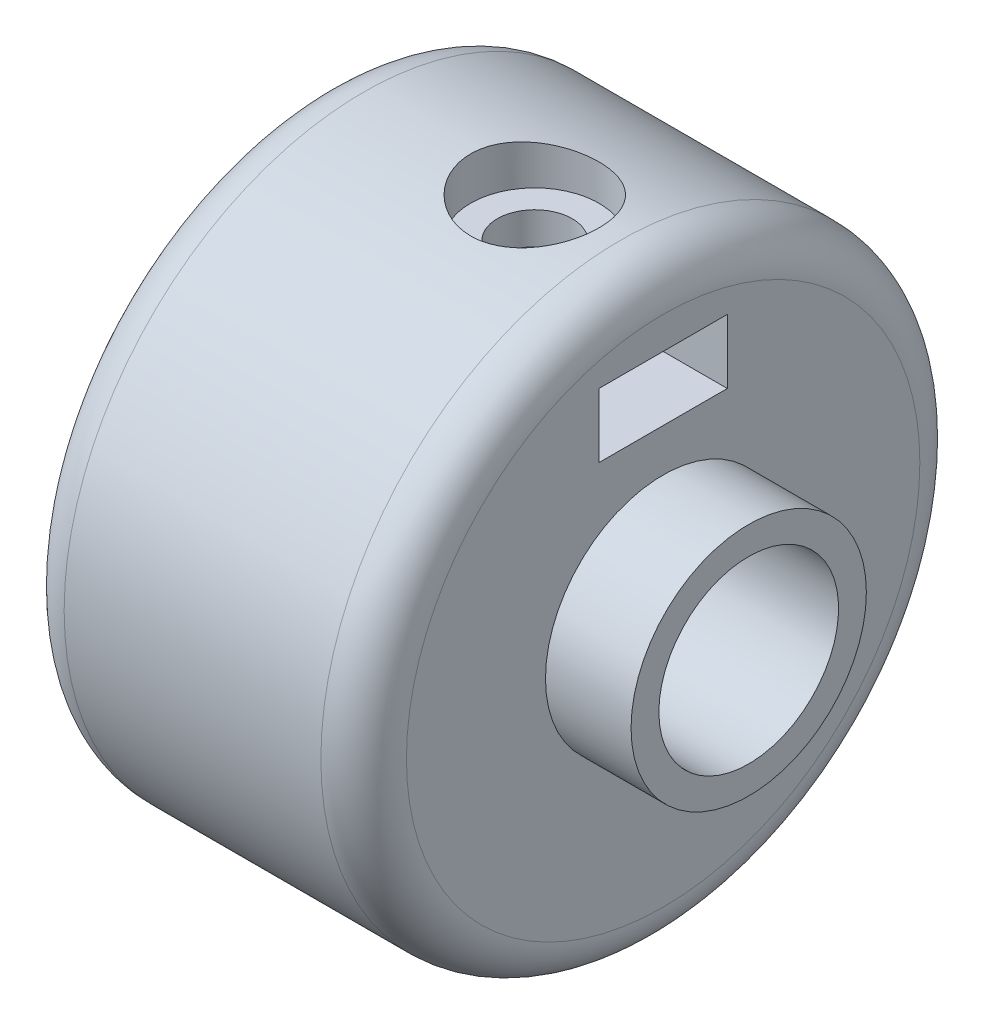
ISO-10303-21;
HEADER;
FILE_DESCRIPTION(('STEP AP214'),'2;1');
FILE_NAME('part.step','',(''),(''),'','','');
FILE_SCHEMA(('AUTOMOTIVE_DESIGN { 1 0 10303 214 1 1 1 1 }'));
ENDSEC;
DATA;
#1=APPLICATION_CONTEXT('core data for automotive mechanical design processes');
#2=APPLICATION_PROTOCOL_DEFINITION('international standard','automotive_design',2000,#1);
#3=PRODUCT_CONTEXT('',#1,'mechanical');
#4=PRODUCT('Part','Part','',(#3));
#5=PRODUCT_RELATED_PRODUCT_CATEGORY('part','',(#4));
#6=PRODUCT_DEFINITION_FORMATION('','',#4);
#7=PRODUCT_DEFINITION_CONTEXT('part definition',#1,'design');
#8=PRODUCT_DEFINITION('design','',#6,#7);
#9=PRODUCT_DEFINITION_SHAPE('','',#8);
#10=(LENGTH_UNIT() NAMED_UNIT(*) SI_UNIT(.MILLI.,.METRE.));
#11=(NAMED_UNIT(*) PLANE_ANGLE_UNIT() SI_UNIT($,.RADIAN.));
#12=(NAMED_UNIT(*) SI_UNIT($,.STERADIAN.) SOLID_ANGLE_UNIT());
#13=UNCERTAINTY_MEASURE_WITH_UNIT(LENGTH_MEASURE(1.E-05),#10,'distance_accuracy_value','');
#14=(GEOMETRIC_REPRESENTATION_CONTEXT(3) GLOBAL_UNCERTAINTY_ASSIGNED_CONTEXT((#13)) GLOBAL_UNIT_ASSIGNED_CONTEXT((#10,
#11,#12)) REPRESENTATION_CONTEXT('',''));
#15=CARTESIAN_POINT('',(0.,0.,0.));
#16=DIRECTION('',(0.,0.,1.));
#17=DIRECTION('',(1.,0.,0.));
#18=AXIS2_PLACEMENT_3D('',#15,#16,#17);
#19=CARTESIAN_POINT('',(-10.,14.,0.));
#20=DIRECTION('',(0.,-1.,0.));
#21=DIRECTION('',(0.,0.,-1.));
#22=AXIS2_PLACEMENT_3D('',#19,#20,#21);
#23=CYLINDRICAL_SURFACE('',#22,1.75);
#24=CARTESIAN_POINT('',(-10.,7.5,0.));
#25=DIRECTION('',(0.,-1.,0.));
#26=DIRECTION('',(0.,0.,-1.));
#27=AXIS2_PLACEMENT_3D('',#24,#25,#26);
#28=CIRCLE('',#27,1.75);
#29=CARTESIAN_POINT('',(-10.,7.5,-1.75));
#30=VERTEX_POINT('',#29);
#31=EDGE_CURVE('E109',#30,#30,#28,.T.);
#32=ORIENTED_EDGE('',*,*,#31,.F.);
#33=EDGE_LOOP('',(#32));
#34=FACE_BOUND('',#33,.T.);
#35=CARTESIAN_POINT('',(-10.,3.8180492401225,-1.75));
#36=CARTESIAN_POINT('',(-9.90665935274441,3.81805927388507,-1.74998962693195));
#37=CARTESIAN_POINT('',(-9.8131662804433,3.8215220334816,-1.74248485434104));
#38=CARTESIAN_POINT('',(-9.62887828112,3.83493367111238,-1.71275550526899));
#39=CARTESIAN_POINT('',(-9.53809138265467,3.84490016153974,-1.69049095604587));
#40=CARTESIAN_POINT('',(-9.3622144184325,3.86997684604675,-1.63225983787231));
#41=CARTESIAN_POINT('',(-9.27710277079898,3.88506604587662,-1.59634912403999));
#42=CARTESIAN_POINT('',(-9.11413677059073,3.9186580799211,-1.51200892856248));
#43=CARTESIAN_POINT('',(-9.03628070719363,3.93716010633097,-1.46358240828144));
#44=CARTESIAN_POINT('',(-8.88514398503714,3.97678067667799,-1.35236343574663));
#45=CARTESIAN_POINT('',(-8.81236941775827,3.99798795310804,-1.28891453345817));
#46=CARTESIAN_POINT('',(-8.67811968850342,4.03990013521117,-1.15083034604377));
#47=CARTESIAN_POINT('',(-8.61664888314179,4.06060484453105,-1.07619076792361));
#48=CARTESIAN_POINT('',(-8.50417065676901,4.10025753102859,-0.913868751316289));
#49=CARTESIAN_POINT('',(-8.45373272075471,4.11909035965407,-0.825761011157124));
#50=CARTESIAN_POINT('',(-8.36861357129215,4.15179127990796,-0.641384831307295));
#51=CARTESIAN_POINT('',(-8.33392536325009,4.1656615748602,-0.545120036820974));
#52=CARTESIAN_POINT('',(-8.28312475774056,4.18624529459313,-0.352475897235232));
#53=CARTESIAN_POINT('',(-8.26613962713714,4.19329359578453,-0.256363206674513));
#54=CARTESIAN_POINT('',(-8.2484073023762,4.20065560055686,-0.062410852511009));
#55=CARTESIAN_POINT('',(-8.24765352176385,4.20097203583421,0.0354280944703224));
#56=CARTESIAN_POINT('',(-8.26194799330665,4.19503180786279,0.223709892157595));
#57=CARTESIAN_POINT('',(-8.27603734073602,4.18917400508129,0.314240484050239));
#58=CARTESIAN_POINT('',(-8.31797434369343,4.17209123450433,0.491516051504038));
#59=CARTESIAN_POINT('',(-8.34582301348223,4.16086587104408,0.578260747476882));
#60=CARTESIAN_POINT('',(-8.4148192572525,4.1339179337964,0.747093365308535));
#61=CARTESIAN_POINT('',(-8.45616324801915,4.11812935976519,0.829090047904868));
#62=CARTESIAN_POINT('',(-8.55078405938048,4.08359999585727,0.985196474194749));
#63=CARTESIAN_POINT('',(-8.60406509718298,4.06485816332757,1.05930341685976));
#64=CARTESIAN_POINT('',(-8.72541538856646,4.02474378287885,1.20307727639109));
#65=CARTESIAN_POINT('',(-8.79426230779061,4.00327892098413,1.27206301224274));
#66=CARTESIAN_POINT('',(-8.94259601698921,3.96113004954058,1.39780398089874));
#67=CARTESIAN_POINT('',(-9.02208689360893,3.94044634383918,1.45455449415404));
#68=CARTESIAN_POINT('',(-9.19275305132667,3.90154257297474,1.55596264950089));
#69=CARTESIAN_POINT('',(-9.28422648804059,3.883425819794,1.60016154697756));
#70=CARTESIAN_POINT('',(-9.47427346296429,3.85293781909416,1.67225004881748));
#71=CARTESIAN_POINT('',(-9.57284186757736,3.84056246468432,1.70015131478238));
#72=CARTESIAN_POINT('',(-9.7674555324796,3.82397697527613,1.7371203523537));
#73=CARTESIAN_POINT('',(-9.86324957116267,3.81928916875964,1.74729260486012));
#74=CARTESIAN_POINT('',(-10.0552698753761,3.81724401534899,1.75175882726598));
#75=CARTESIAN_POINT('',(-10.1514959798684,3.81988413239047,1.74605829045409));
#76=CARTESIAN_POINT('',(-10.3351577396026,3.83170383884049,1.71994868591779));
#77=CARTESIAN_POINT('',(-10.4227617615015,3.84045393223265,1.70050466345268));
#78=CARTESIAN_POINT('',(-10.593391815097,3.86295882416425,1.64873881989916));
#79=CARTESIAN_POINT('',(-10.676416771563,3.87671479244225,1.61641398874375));
#80=CARTESIAN_POINT('',(-10.8394614344991,3.908391169998,1.53828529127261));
#81=CARTESIAN_POINT('',(-10.9192049644545,3.92646327083195,1.49196856628677));
#82=CARTESIAN_POINT('',(-11.0701712734986,3.96452005237111,1.38768109814036));
#83=CARTESIAN_POINT('',(-11.1413903433826,3.98450555888817,1.32970531102638));
#84=CARTESIAN_POINT('',(-11.2793201888376,4.02610067698345,1.19818223800171));
#85=CARTESIAN_POINT('',(-11.3451919599309,4.04771005392378,1.12375152607164));
#86=CARTESIAN_POINT('',(-11.4636612087711,4.08860705657493,0.964392117574956));
#87=CARTESIAN_POINT('',(-11.5162577136892,4.10789451207819,0.87946265232512));
#88=CARTESIAN_POINT('',(-11.606625825621,4.1420995221991,0.700916553124739));
#89=CARTESIAN_POINT('',(-11.6443591378053,4.15700576394357,0.60727823749391));
#90=CARTESIAN_POINT('',(-11.7032635092682,4.18065442344712,0.414202369216184));
#91=CARTESIAN_POINT('',(-11.7244444255165,4.18940050927888,0.314768305915274));
#92=CARTESIAN_POINT('',(-11.7484013757284,4.19932148716514,0.120423146908976));
#93=CARTESIAN_POINT('',(-11.7523603995757,4.20098286347916,0.0256817187114579));
#94=CARTESIAN_POINT('',(-11.7449416021885,4.19789332873334,-0.163081536399998));
#95=CARTESIAN_POINT('',(-11.733566469582,4.19314354178039,-0.257103486557616));
#96=CARTESIAN_POINT('',(-11.6966514989779,4.17802092374428,-0.438321075428858));
#97=CARTESIAN_POINT('',(-11.6716284473426,4.16785353892927,-0.525640552980997));
#98=CARTESIAN_POINT('',(-11.6086920539072,4.14301299785881,-0.694809122701863));
#99=CARTESIAN_POINT('',(-11.5707762634691,4.12833898573889,-0.776657172180158));
#100=CARTESIAN_POINT('',(-11.4812146590998,4.09508155558127,-0.936634391670294));
#101=CARTESIAN_POINT('',(-11.4290257780064,4.07635142864272,-1.01442832116736));
#102=CARTESIAN_POINT('',(-11.3131899439794,4.03720186623923,-1.16048614589429));
#103=CARTESIAN_POINT('',(-11.2495387374305,4.01678180517316,-1.22874648650046));
#104=CARTESIAN_POINT('',(-11.1074772438038,3.97480783362797,-1.35862970212421));
#105=CARTESIAN_POINT('',(-11.0283573795304,3.95327132001054,-1.41948485510786));
#106=CARTESIAN_POINT('',(-10.8603577630477,3.9129377376626,-1.52716665229344));
#107=CARTESIAN_POINT('',(-10.7714725927186,3.89414220331582,-1.57398545439457));
#108=CARTESIAN_POINT('',(-10.5866786309681,3.86179580825699,-1.65175872461008));
#109=CARTESIAN_POINT('',(-10.4908103776895,3.84821716257811,-1.68279753085995));
#110=CARTESIAN_POINT('',(-10.2946445966091,3.82817124293334,-1.72792979035322));
#111=CARTESIAN_POINT('',(-10.194363109816,3.82168012246973,-1.74208008129694));
#112=CARTESIAN_POINT('',(-10.0624980660334,3.81842971625763,-1.7491665089311));
#113=CARTESIAN_POINT('',(-10.0312575796567,3.81804588005224,-1.75000347369566));
#114=CARTESIAN_POINT('',(-10.,3.8180492401225,-1.75));
#115=B_SPLINE_CURVE_WITH_KNOTS('',3,(#35,#36,#37,#38,#39,#40,#41,#42,#43,#44,#45,#46,#47,#48,
#49,#50,#51,#52,#53,#54,#55,#56,#57,#58,#59,#60,#61,#62,#63,#64,#65,#66,#67,#68,#69,#70,#71,#72,
#73,#74,#75,#76,#77,#78,#79,#80,#81,#82,#83,#84,#85,#86,#87,#88,#89,#90,#91,#92,#93,#94,#95,#96,
#97,#98,#99,#100,#101,#102,#103,#104,#105,#106,#107,#108,#109,#110,#111,#112,#113,#114),
.UNSPECIFIED.,.T.,.F.,(4,2,2,2,2,2,2,2,2,2,2,2,2,2,2,2,2,2,2,2,2,2,2,2,2,2,2,2,2,2,2,2,2,2,2,2,
2,2,2,4),(0.,0.279932396779721,0.560626026579045,0.840182913012955,1.11967371397014,
1.41493578002915,1.71031140643875,2.01849867209094,2.32654893484848,2.61856848369133,
2.91046953285103,3.1846057634313,3.45876220482637,3.73710140496092,4.01553909431478,
4.31360344582278,4.61178256617913,4.91976163933411,5.22752007043797,5.51531089628831,
5.80300213525828,6.07227461492669,6.34161005678942,6.62235177545437,6.90321521113652,
7.20694327829719,7.51069359658613,7.81522148337833,8.11956788500211,8.40264089131675,
8.6856642712268,8.95864781051083,9.23168322485042,9.51705807960652,9.80253905468467,
10.1074459767131,10.4125229339487,10.7159517611561,11.0183565036463,11.1120992561139),.UNSPECIFIED.);
#116=CARTESIAN_POINT('',(-10.,3.8180492401225,-1.75));
#117=VERTEX_POINT('',#116);
#118=EDGE_CURVE('E120',#117,#117,#115,.T.);
#119=ORIENTED_EDGE('',*,*,#118,.T.);
#120=EDGE_LOOP('',(#119));
#121=FACE_BOUND('',#120,.T.);
#122=ADVANCED_FACE('F35',(#34,#121),#23,.F.);
#123=CARTESIAN_POINT('',(-10.,10.5,0.));
#124=DIRECTION('',(0.,1.,0.));
#125=DIRECTION('',(0.,0.,1.));
#126=AXIS2_PLACEMENT_3D('',#123,#124,#125);
#127=CIRCLE('',#126,1.75);
#128=CARTESIAN_POINT('',(-10.,10.5,1.75));
#129=VERTEX_POINT('',#128);
#130=EDGE_CURVE('E103',#129,#129,#127,.T.);
#131=ORIENTED_EDGE('',*,*,#130,.F.);
#132=EDGE_LOOP('',(#131));
#133=FACE_BOUND('',#132,.T.);
#134=CARTESIAN_POINT('',(-10.,12.,0.));
#135=DIRECTION('',(0.,1.,0.));
#136=DIRECTION('',(0.,0.,1.));
#137=AXIS2_PLACEMENT_3D('',#134,#135,#136);
#138=CIRCLE('',#137,1.75);
#139=CARTESIAN_POINT('',(-10.,12.,1.75));
#140=VERTEX_POINT('',#139);
#141=EDGE_CURVE('E115',#140,#140,#138,.T.);
#142=ORIENTED_EDGE('',*,*,#141,.T.);
#143=EDGE_LOOP('',(#142));
#144=FACE_BOUND('',#143,.T.);
#145=ADVANCED_FACE('F140',(#133,#144),#23,.F.);
#146=CARTESIAN_POINT('',(-12.0159026854066,0.,0.));
#147=DIRECTION('',(-1.,0.,0.));
#148=DIRECTION('',(0.,0.,1.));
#149=AXIS2_PLACEMENT_3D('',#146,#147,#148);
#150=CYLINDRICAL_SURFACE('',#149,14.);
#151=CARTESIAN_POINT('',(-6.,0.,0.));
#152=DIRECTION('',(-1.,0.,0.));
#153=DIRECTION('',(0.,0.,1.));
#154=AXIS2_PLACEMENT_3D('',#151,#152,#153);
#155=CIRCLE('',#154,14.);
#156=CARTESIAN_POINT('',(-6.,0.,14.));
#157=VERTEX_POINT('',#156);
#158=EDGE_CURVE('E341',#157,#157,#155,.T.);
#159=ORIENTED_EDGE('',*,*,#158,.T.);
#160=EDGE_LOOP('',(#159));
#161=FACE_BOUND('',#160,.T.);
#162=CARTESIAN_POINT('',(-18.,0.,0.));
#163=DIRECTION('',(1.,0.,0.));
#164=DIRECTION('',(0.,0.,-1.));
#165=AXIS2_PLACEMENT_3D('',#162,#163,#164);
#166=CIRCLE('',#165,14.);
#167=CARTESIAN_POINT('',(-18.,0.,-14.));
#168=VERTEX_POINT('',#167);
#169=EDGE_CURVE('E338',#168,#168,#166,.T.);
#170=ORIENTED_EDGE('',*,*,#169,.T.);
#171=EDGE_LOOP('',(#170));
#172=FACE_BOUND('',#171,.T.);
#173=CARTESIAN_POINT('',(-10.,13.6747943311773,3.));
#174=CARTESIAN_POINT('',(-10.166422304966,13.6747976912119,2.99999416477353));
#175=CARTESIAN_POINT('',(-10.3329155478848,13.6778654468474,2.9861047248957));
#176=CARTESIAN_POINT('',(-10.6611733444834,13.6897835685885,2.93097118505965));
#177=CARTESIAN_POINT('',(-10.8229342973523,13.6986382242345,2.88970679307235));
#178=CARTESIAN_POINT('',(-11.1369314991486,13.7210823058705,2.78117727369208));
#179=CARTESIAN_POINT('',(-11.289177756243,13.7346666545171,2.71394001982631));
#180=CARTESIAN_POINT('',(-11.5802305478892,13.7650334169723,2.55545235346679));
#181=CARTESIAN_POINT('',(-11.7190374740581,13.7818157375507,2.46420264097551));
#182=CARTESIAN_POINT('',(-11.9815259229643,13.8169915759332,2.25870285140442));
#183=CARTESIAN_POINT('',(-12.1049577524799,13.8354049974351,2.14413718967966));
#184=CARTESIAN_POINT('',(-12.3310071088116,13.8715938342079,1.89593901625915));
#185=CARTESIAN_POINT('',(-12.4336230577201,13.8893692010283,1.76230506043535));
#186=CARTESIAN_POINT('',(-12.6161108889829,13.9224953821886,1.47809457692917));
#187=CARTESIAN_POINT('',(-12.6957433115412,13.9378199763886,1.32736097645991));
#188=CARTESIAN_POINT('',(-12.8284553828926,13.9640934208587,1.01426853868519));
#189=CARTESIAN_POINT('',(-12.8815378895726,13.9750427420666,0.851910954760625));
#190=CARTESIAN_POINT('',(-12.9588599418627,13.9911913056236,0.522774375343025));
#191=CARTESIAN_POINT('',(-12.9835218571049,13.9964746675677,0.356098801193848));
#192=CARTESIAN_POINT('',(-13.0046225546265,14.00098724414,0.0208978906132903));
#193=CARTESIAN_POINT('',(-13.0010644411215,14.000217124654,-0.147627240329518));
#194=CARTESIAN_POINT('',(-12.9661420706728,13.9927740172512,-0.478834058501023));
#195=CARTESIAN_POINT('',(-12.9352329994202,13.9861976630486,-0.641566230724225));
#196=CARTESIAN_POINT('',(-12.8472106362963,13.9679908317821,-0.959478927956778));
#197=CARTESIAN_POINT('',(-12.7900961914005,13.9563601323304,-1.11465912035011));
#198=CARTESIAN_POINT('',(-12.650877082223,13.9291950929372,-1.41433499511311));
#199=CARTESIAN_POINT('',(-12.5685984655913,13.9136337160789,-1.55874731403158));
#200=CARTESIAN_POINT('',(-12.3815160636728,13.8803158748773,-1.83188185312569));
#201=CARTESIAN_POINT('',(-12.2767093253994,13.8625591228939,-1.96060201290306));
#202=CARTESIAN_POINT('',(-12.0450629109443,13.8263865292185,-2.20140417600396));
#203=CARTESIAN_POINT('',(-11.9178248412859,13.8079646074571,-2.31310234640501));
#204=CARTESIAN_POINT('',(-11.646233429863,13.7728713366395,-2.51364486469456));
#205=CARTESIAN_POINT('',(-11.5018796611895,13.7562000312677,-2.60248864236136));
#206=CARTESIAN_POINT('',(-11.1995509978725,13.7264804717345,-2.75496155146593));
#207=CARTESIAN_POINT('',(-11.0415397522951,13.7134423025555,-2.81852070177845));
#208=CARTESIAN_POINT('',(-10.7167344681071,13.6926068161323,-2.91806990318231));
#209=CARTESIAN_POINT('',(-10.5499417651136,13.6848087043697,-2.95406413389256));
#210=CARTESIAN_POINT('',(-10.2158084947006,13.6754976251089,-2.99687172049304));
#211=CARTESIAN_POINT('',(-10.0485426498454,13.673864541034,-3.0042428385728));
#212=CARTESIAN_POINT('',(-9.71517201363661,13.6767447914799,-2.99110279284747));
#213=CARTESIAN_POINT('',(-9.5490671466929,13.6812577220213,-2.9705934616327));
#214=CARTESIAN_POINT('',(-9.22465913003848,13.6958083096841,-2.90275789271168));
#215=CARTESIAN_POINT('',(-9.06628913480608,13.7057831054873,-2.85573660503107));
#216=CARTESIAN_POINT('',(-8.75967532493416,13.7300771973955,-2.73654105893499));
#217=CARTESIAN_POINT('',(-8.61143244873161,13.744396895457,-2.66436447325637));
#218=CARTESIAN_POINT('',(-8.32686063048216,13.7760326816069,-2.4956700883341));
#219=CARTESIAN_POINT('',(-8.19074083597563,13.7933900349263,-2.39880737181585));
#220=CARTESIAN_POINT('',(-7.93648330825241,13.8290355072028,-2.18394367667201));
#221=CARTESIAN_POINT('',(-7.81834771710307,13.8473237366892,-2.06594018364322));
#222=CARTESIAN_POINT('',(-7.60125939411048,13.8831647998035,-1.80962552884163));
#223=CARTESIAN_POINT('',(-7.50268616768598,13.9006987121549,-1.67098985165754));
#224=CARTESIAN_POINT('',(-7.3302291812979,13.932712214298,-1.37880296256455));
#225=CARTESIAN_POINT('',(-7.25634429405434,13.9471919435339,-1.22525243208748));
#226=CARTESIAN_POINT('',(-7.13589589072304,13.9713855676315,-0.908530837964082));
#227=CARTESIAN_POINT('',(-7.08916339250744,13.9811288760739,-0.745426386150348));
#228=CARTESIAN_POINT('',(-7.02381658853537,13.9948787860397,-0.413450354006578));
#229=CARTESIAN_POINT('',(-7.00519836805219,13.9988861862461,-0.24457957994798));
#230=CARTESIAN_POINT('',(-6.99677869517627,14.000690220181,0.0905274341056484));
#231=CARTESIAN_POINT('',(-7.0064096827907,13.9986091800327,0.256749011018429));
#232=CARTESIAN_POINT('',(-7.05294952703811,13.9887310472683,0.585145876831948));
#233=CARTESIAN_POINT('',(-7.08985793115682,13.9809340494761,0.747321232810674));
#234=CARTESIAN_POINT('',(-7.1896376124988,13.9605077727683,1.06260389697443));
#235=CARTESIAN_POINT('',(-7.25243137877043,13.9478929286009,1.21573673014596));
#236=CARTESIAN_POINT('',(-7.40212254233893,13.9191807210222,1.50936991344683));
#237=CARTESIAN_POINT('',(-7.48902217661461,13.9030830344402,1.64986908959375));
#238=CARTESIAN_POINT('',(-7.68632463748274,13.8687961986559,1.91702461378899));
#239=CARTESIAN_POINT('',(-7.79712831663283,13.8505741780296,2.04338073020593));
#240=CARTESIAN_POINT('',(-8.03828122051049,13.8142738016446,2.27590002915847));
#241=CARTESIAN_POINT('',(-8.16863512674778,13.7961954813912,2.38205836126942));
#242=CARTESIAN_POINT('',(-8.44718098633924,13.761973872554,2.57246523191562));
#243=CARTESIAN_POINT('',(-8.59557871644544,13.7458581173137,2.65641795611844));
#244=CARTESIAN_POINT('',(-8.90468744171683,13.7177299427787,2.79806009312271));
#245=CARTESIAN_POINT('',(-9.06538769047185,13.7057139912142,2.8557721284606));
#246=CARTESIAN_POINT('',(-9.35525226239235,13.6894112131582,2.93277214244341));
#247=CARTESIAN_POINT('',(-9.48282335142122,13.683965661845,2.95793505015818));
#248=CARTESIAN_POINT('',(-9.74024862314907,13.6766559900021,2.99155088086543));
#249=CARTESIAN_POINT('',(-9.87010270301497,13.6747917085757,3.00000455455863));
#250=CARTESIAN_POINT('',(-10.,13.6747943311773,3.));
#251=B_SPLINE_CURVE_WITH_KNOTS('',3,(#173,#174,#175,#176,#177,#178,#179,#180,#181,#182,#183,
#184,#185,#186,#187,#188,#189,#190,#191,#192,#193,#194,#195,#196,#197,#198,#199,#200,#201,#202,
#203,#204,#205,#206,#207,#208,#209,#210,#211,#212,#213,#214,#215,#216,#217,#218,#219,#220,#221,
#222,#223,#224,#225,#226,#227,#228,#229,#230,#231,#232,#233,#234,#235,#236,#237,#238,#239,#240,
#241,#242,#243,#244,#245,#246,#247,#248,#249,#250),.UNSPECIFIED.,.T.,.F.,(4,2,2,2,2,2,2,2,2,2,2,
2,2,2,2,2,2,2,2,2,2,2,2,2,2,2,2,2,2,2,2,2,2,2,2,2,2,2,4),(0.,0.498790964055055,
0.997952076959928,1.49657898230552,1.99519135347057,2.50106459165384,3.00697616225757,
3.51798269640557,4.02893421292535,4.53219016303857,5.03539075554482,5.53037115334743,
6.02537333215167,6.52387776286874,7.0224475774463,7.5309792155859,8.03952354046184,
8.54946574823562,9.05933061907677,9.55920866385046,10.0590538530783,10.5532636149875,
11.047519111263,11.5491002043264,12.0507409931816,12.5613242936642,13.0718842775108,
13.5792317964875,14.0865086641708,14.5836639928825,15.080811074302,15.5764801923897,
16.0721953230273,16.5769782832193,17.0818823126246,17.593207603363,18.1040912322742,
18.4934291224859,18.8827495204009),.UNSPECIFIED.);
#252=CARTESIAN_POINT('',(-10.,13.6747943311773,3.));
#253=VERTEX_POINT('',#252);
#254=EDGE_CURVE('E129',#253,#253,#251,.T.);
#255=ORIENTED_EDGE('',*,*,#254,.T.);
#256=EDGE_LOOP('',(#255));
#257=FACE_BOUND('',#256,.T.);
#258=ADVANCED_FACE('F144',(#161,#172,#257),#150,.T.);
#259=CARTESIAN_POINT('',(-12.0159026854066,0.,0.));
#260=DIRECTION('',(-1.,0.,0.));
#261=DIRECTION('',(0.,0.,1.));
#262=AXIS2_PLACEMENT_3D('',#259,#260,#261);
#263=CYLINDRICAL_SURFACE('',#262,4.2);
#264=CARTESIAN_POINT('',(-15.,0.,0.));
#265=DIRECTION('',(-1.,0.,0.));
#266=DIRECTION('',(0.,0.,1.));
#267=AXIS2_PLACEMENT_3D('',#264,#265,#266);
#268=CIRCLE('',#267,4.2);
#269=CARTESIAN_POINT('',(-15.,0.,4.2));
#270=VERTEX_POINT('',#269);
#271=EDGE_CURVE('E119',#270,#270,#268,.T.);
#272=ORIENTED_EDGE('',*,*,#271,.T.);
#273=EDGE_LOOP('',(#272));
#274=FACE_BOUND('',#273,.T.);
#275=CARTESIAN_POINT('',(0.,0.,0.));
#276=DIRECTION('',(-1.,0.,0.));
#277=DIRECTION('',(0.,0.,1.));
#278=AXIS2_PLACEMENT_3D('',#275,#276,#277);
#279=CIRCLE('',#278,4.2);
#280=CARTESIAN_POINT('',(0.,0.,4.2));
#281=VERTEX_POINT('',#280);
#282=EDGE_CURVE('E116',#281,#281,#279,.T.);
#283=ORIENTED_EDGE('',*,*,#282,.F.);
#284=EDGE_LOOP('',(#283));
#285=FACE_BOUND('',#284,.T.);
#286=ORIENTED_EDGE('',*,*,#118,.F.);
#287=EDGE_LOOP('',(#286));
#288=FACE_BOUND('',#287,.T.);
#289=ADVANCED_FACE('F137',(#274,#285,#288),#263,.F.);
#290=CARTESIAN_POINT('',(0.,5.5,0.));
#291=DIRECTION('',(-1.,0.,0.));
#292=DIRECTION('',(0.,0.,1.));
#293=AXIS2_PLACEMENT_3D('',#290,#291,#292);
#294=PLANE('',#293);
#295=CARTESIAN_POINT('',(0.,0.,0.));
#296=DIRECTION('',(-1.,0.,0.));
#297=DIRECTION('',(0.,0.,1.));
#298=AXIS2_PLACEMENT_3D('',#295,#296,#297);
#299=CIRCLE('',#298,5.5);
#300=CARTESIAN_POINT('',(0.,0.,5.5));
#301=VERTEX_POINT('',#300);
#302=EDGE_CURVE('E126',#301,#301,#299,.T.);
#303=ORIENTED_EDGE('',*,*,#302,.F.);
#304=EDGE_LOOP('',(#303));
#305=FACE_BOUND('',#304,.T.);
#306=ORIENTED_EDGE('',*,*,#282,.T.);
#307=EDGE_LOOP('',(#306));
#308=FACE_BOUND('',#307,.T.);
#309=ADVANCED_FACE('F174',(#305,#308),#294,.F.);
#310=CARTESIAN_POINT('',(-12.0159026854066,0.,0.));
#311=DIRECTION('',(-1.,0.,0.));
#312=DIRECTION('',(0.,0.,1.));
#313=AXIS2_PLACEMENT_3D('',#310,#311,#312);
#314=CYLINDRICAL_SURFACE('',#313,5.5);
#315=CARTESIAN_POINT('',(-4.,0.,0.));
#316=DIRECTION('',(-1.,0.,0.));
#317=DIRECTION('',(0.,0.,1.));
#318=AXIS2_PLACEMENT_3D('',#315,#316,#317);
#319=CIRCLE('',#318,5.5);
#320=CARTESIAN_POINT('',(-4.,0.,5.5));
#321=VERTEX_POINT('',#320);
#322=EDGE_CURVE('E123',#321,#321,#319,.T.);
#323=ORIENTED_EDGE('',*,*,#322,.F.);
#324=EDGE_LOOP('',(#323));
#325=FACE_BOUND('',#324,.T.);
#326=ORIENTED_EDGE('',*,*,#302,.T.);
#327=EDGE_LOOP('',(#326));
#328=FACE_BOUND('',#327,.T.);
#329=ADVANCED_FACE('F170',(#325,#328),#314,.T.);
#330=CARTESIAN_POINT('',(-4.,5.5,0.));
#331=DIRECTION('',(-1.,0.,0.));
#332=DIRECTION('',(0.,0.,1.));
#333=AXIS2_PLACEMENT_3D('',#330,#331,#332);
#334=PLANE('',#333);
#335=CARTESIAN_POINT('',(-4.,0.,0.));
#336=DIRECTION('',(-1.,0.,0.));
#337=DIRECTION('',(0.,0.,1.));
#338=AXIS2_PLACEMENT_3D('',#335,#336,#337);
#339=CIRCLE('',#338,12.);
#340=CARTESIAN_POINT('',(-4.,0.,12.));
#341=VERTEX_POINT('',#340);
#342=EDGE_CURVE('E43',#341,#341,#339,.F.);
#343=ORIENTED_EDGE('',*,*,#342,.T.);
#344=EDGE_LOOP('',(#343));
#345=FACE_BOUND('',#344,.T.);
#346=DIRECTION('',(0.,0.,-1.));
#347=VECTOR('',#346,1.);
#348=CARTESIAN_POINT('',(-4.,10.5,0.));
#349=LINE('',#348,#347);
#350=CARTESIAN_POINT('',(-4.,10.5,3.));
#351=VERTEX_POINT('',#350);
#352=CARTESIAN_POINT('',(-4.,10.5,-3.));
#353=VERTEX_POINT('',#352);
#354=EDGE_CURVE('E159',#351,#353,#349,.T.);
#355=ORIENTED_EDGE('',*,*,#354,.T.);
#356=DIRECTION('',(0.,-1.,0.));
#357=VECTOR('',#356,1.);
#358=CARTESIAN_POINT('',(-4.,5.5,-3.));
#359=LINE('',#358,#357);
#360=CARTESIAN_POINT('',(-4.,7.5,-3.));
#361=VERTEX_POINT('',#360);
#362=EDGE_CURVE('E81',#353,#361,#359,.T.);
#363=ORIENTED_EDGE('',*,*,#362,.T.);
#364=DIRECTION('',(0.,0.,1.));
#365=VECTOR('',#364,1.);
#366=CARTESIAN_POINT('',(-4.,7.5,0.));
#367=LINE('',#366,#365);
#368=CARTESIAN_POINT('',(-4.,7.5,3.));
#369=VERTEX_POINT('',#368);
#370=EDGE_CURVE('E58',#361,#369,#367,.T.);
#371=ORIENTED_EDGE('',*,*,#370,.T.);
#372=DIRECTION('',(0.,1.,0.));
#373=VECTOR('',#372,1.);
#374=CARTESIAN_POINT('',(-4.,5.5,3.));
#375=LINE('',#374,#373);
#376=EDGE_CURVE('E335',#369,#351,#375,.T.);
#377=ORIENTED_EDGE('',*,*,#376,.T.);
#378=EDGE_LOOP('',(#355,#363,#371,#377));
#379=FACE_BOUND('',#378,.T.);
#380=ORIENTED_EDGE('',*,*,#322,.T.);
#381=EDGE_LOOP('',(#380));
#382=FACE_BOUND('',#381,.T.);
#383=ADVANCED_FACE('F167',(#345,#379,#382),#334,.F.);
#384=CARTESIAN_POINT('',(-20.,14.,0.));
#385=DIRECTION('',(1.,0.,0.));
#386=DIRECTION('',(0.,0.,-1.));
#387=AXIS2_PLACEMENT_3D('',#384,#385,#386);
#388=PLANE('',#387);
#389=CARTESIAN_POINT('',(-20.,0.,0.));
#390=DIRECTION('',(1.,0.,0.));
#391=DIRECTION('',(0.,0.,-1.));
#392=AXIS2_PLACEMENT_3D('',#389,#390,#391);
#393=CIRCLE('',#392,12.);
#394=CARTESIAN_POINT('',(-20.,0.,-12.));
#395=VERTEX_POINT('',#394);
#396=EDGE_CURVE('E11',#395,#395,#393,.F.);
#397=ORIENTED_EDGE('',*,*,#396,.T.);
#398=EDGE_LOOP('',(#397));
#399=FACE_BOUND('',#398,.T.);
#400=ADVANCED_FACE('F166',(#399),#388,.F.);
#401=CARTESIAN_POINT('',(-15.,4.2,0.));
#402=DIRECTION('',(-1.,0.,0.));
#403=DIRECTION('',(0.,0.,1.));
#404=AXIS2_PLACEMENT_3D('',#401,#402,#403);
#405=PLANE('',#404);
#406=ORIENTED_EDGE('',*,*,#271,.F.);
#407=EDGE_LOOP('',(#406));
#408=FACE_BOUND('',#407,.T.);
#409=ADVANCED_FACE('F151',(#408),#405,.F.);
#410=CARTESIAN_POINT('',(-10.,12.,0.));
#411=DIRECTION('',(0.,1.,0.));
#412=DIRECTION('',(0.,0.,1.));
#413=AXIS2_PLACEMENT_3D('',#410,#411,#412);
#414=CYLINDRICAL_SURFACE('',#413,3.);
#415=CARTESIAN_POINT('',(-10.,12.,0.));
#416=DIRECTION('',(0.,1.,0.));
#417=DIRECTION('',(0.,0.,1.));
#418=AXIS2_PLACEMENT_3D('',#415,#416,#417);
#419=CIRCLE('',#418,3.);
#420=CARTESIAN_POINT('',(-10.,12.,3.));
#421=VERTEX_POINT('',#420);
#422=EDGE_CURVE('E112',#421,#421,#419,.T.);
#423=ORIENTED_EDGE('',*,*,#422,.F.);
#424=EDGE_LOOP('',(#423));
#425=FACE_BOUND('',#424,.T.);
#426=ORIENTED_EDGE('',*,*,#254,.F.);
#427=EDGE_LOOP('',(#426));
#428=FACE_BOUND('',#427,.T.);
#429=ADVANCED_FACE('F146',(#425,#428),#414,.F.);
#430=CARTESIAN_POINT('',(-10.,12.,0.));
#431=DIRECTION('',(0.,1.,0.));
#432=DIRECTION('',(0.,0.,1.));
#433=AXIS2_PLACEMENT_3D('',#430,#431,#432);
#434=PLANE('',#433);
#435=ORIENTED_EDGE('',*,*,#141,.F.);
#436=EDGE_LOOP('',(#435));
#437=FACE_BOUND('',#436,.T.);
#438=ORIENTED_EDGE('',*,*,#422,.T.);
#439=EDGE_LOOP('',(#438));
#440=FACE_BOUND('',#439,.T.);
#441=ADVANCED_FACE('F150',(#437,#440),#434,.T.);
#442=CARTESIAN_POINT('',(-15.,10.5,-3.));
#443=DIRECTION('',(0.,0.,-1.));
#444=DIRECTION('',(-1.,0.,0.));
#445=AXIS2_PLACEMENT_3D('',#442,#443,#444);
#446=PLANE('',#445);
#447=DIRECTION('',(1.,0.,0.));
#448=VECTOR('',#447,1.);
#449=CARTESIAN_POINT('',(-15.,10.5,-3.));
#450=LINE('',#449,#448);
#451=CARTESIAN_POINT('',(-15.,10.5,-3.));
#452=VERTEX_POINT('',#451);
#453=EDGE_CURVE('E50',#452,#353,#450,.T.);
#454=ORIENTED_EDGE('',*,*,#453,.F.);
#455=DIRECTION('',(0.,1.,0.));
#456=VECTOR('',#455,1.);
#457=CARTESIAN_POINT('',(-15.,10.5,-3.));
#458=LINE('',#457,#456);
#459=CARTESIAN_POINT('',(-15.,7.5,-3.));
#460=VERTEX_POINT('',#459);
#461=EDGE_CURVE('E78',#460,#452,#458,.T.);
#462=ORIENTED_EDGE('',*,*,#461,.F.);
#463=DIRECTION('',(1.,0.,0.));
#464=VECTOR('',#463,1.);
#465=CARTESIAN_POINT('',(-15.,7.5,-3.));
#466=LINE('',#465,#464);
#467=EDGE_CURVE('E101',#460,#361,#466,.T.);
#468=ORIENTED_EDGE('',*,*,#467,.T.);
#469=ORIENTED_EDGE('',*,*,#362,.F.);
#470=EDGE_LOOP('',(#454,#462,#468,#469));
#471=FACE_BOUND('',#470,.T.);
#472=ADVANCED_FACE('F76',(#471),#446,.F.);
#473=CARTESIAN_POINT('',(-15.,7.5,3.));
#474=DIRECTION('',(0.,-1.,0.));
#475=DIRECTION('',(0.,0.,-1.));
#476=AXIS2_PLACEMENT_3D('',#473,#474,#475);
#477=PLANE('',#476);
#478=ORIENTED_EDGE('',*,*,#31,.T.);
#479=EDGE_LOOP('',(#478));
#480=FACE_BOUND('',#479,.T.);
#481=ORIENTED_EDGE('',*,*,#467,.F.);
#482=DIRECTION('',(0.,0.,-1.));
#483=VECTOR('',#482,1.);
#484=CARTESIAN_POINT('',(-15.,7.5,3.));
#485=LINE('',#484,#483);
#486=CARTESIAN_POINT('',(-15.,7.5,3.));
#487=VERTEX_POINT('',#486);
#488=EDGE_CURVE('E84',#487,#460,#485,.T.);
#489=ORIENTED_EDGE('',*,*,#488,.F.);
#490=DIRECTION('',(1.,0.,0.));
#491=VECTOR('',#490,1.);
#492=CARTESIAN_POINT('',(-15.,7.5,3.));
#493=LINE('',#492,#491);
#494=EDGE_CURVE('E104',#487,#369,#493,.T.);
#495=ORIENTED_EDGE('',*,*,#494,.T.);
#496=ORIENTED_EDGE('',*,*,#370,.F.);
#497=EDGE_LOOP('',(#481,#489,#495,#496));
#498=FACE_BOUND('',#497,.T.);
#499=ADVANCED_FACE('F278',(#480,#498),#477,.F.);
#500=CARTESIAN_POINT('',(-15.,10.5,3.));
#501=DIRECTION('',(0.,0.,1.));
#502=DIRECTION('',(0.,-1.,0.));
#503=AXIS2_PLACEMENT_3D('',#500,#501,#502);
#504=PLANE('',#503);
#505=ORIENTED_EDGE('',*,*,#494,.F.);
#506=DIRECTION('',(0.,-1.,0.));
#507=VECTOR('',#506,1.);
#508=CARTESIAN_POINT('',(-15.,10.5,3.));
#509=LINE('',#508,#507);
#510=CARTESIAN_POINT('',(-15.,10.5,3.));
#511=VERTEX_POINT('',#510);
#512=EDGE_CURVE('E93',#511,#487,#509,.T.);
#513=ORIENTED_EDGE('',*,*,#512,.F.);
#514=DIRECTION('',(1.,0.,0.));
#515=VECTOR('',#514,1.);
#516=CARTESIAN_POINT('',(-15.,10.5,3.));
#517=LINE('',#516,#515);
#518=EDGE_CURVE('E83',#511,#351,#517,.T.);
#519=ORIENTED_EDGE('',*,*,#518,.T.);
#520=ORIENTED_EDGE('',*,*,#376,.F.);
#521=EDGE_LOOP('',(#505,#513,#519,#520));
#522=FACE_BOUND('',#521,.T.);
#523=ADVANCED_FACE('F285',(#522),#504,.F.);
#524=CARTESIAN_POINT('',(-15.,10.5,3.));
#525=DIRECTION('',(0.,1.,0.));
#526=DIRECTION('',(0.,0.,1.));
#527=AXIS2_PLACEMENT_3D('',#524,#525,#526);
#528=PLANE('',#527);
#529=ORIENTED_EDGE('',*,*,#130,.T.);
#530=EDGE_LOOP('',(#529));
#531=FACE_BOUND('',#530,.T.);
#532=ORIENTED_EDGE('',*,*,#518,.F.);
#533=DIRECTION('',(0.,0.,1.));
#534=VECTOR('',#533,1.);
#535=CARTESIAN_POINT('',(-15.,10.5,3.));
#536=LINE('',#535,#534);
#537=EDGE_CURVE('E87',#452,#511,#536,.T.);
#538=ORIENTED_EDGE('',*,*,#537,.F.);
#539=ORIENTED_EDGE('',*,*,#453,.T.);
#540=ORIENTED_EDGE('',*,*,#354,.F.);
#541=EDGE_LOOP('',(#532,#538,#539,#540));
#542=FACE_BOUND('',#541,.T.);
#543=ADVANCED_FACE('F88',(#531,#542),#528,.F.);
#544=CARTESIAN_POINT('',(-15.,0.,0.));
#545=DIRECTION('',(1.,0.,0.));
#546=DIRECTION('',(0.,0.,-1.));
#547=AXIS2_PLACEMENT_3D('',#544,#545,#546);
#548=PLANE('',#547);
#549=ORIENTED_EDGE('',*,*,#461,.T.);
#550=ORIENTED_EDGE('',*,*,#537,.T.);
#551=ORIENTED_EDGE('',*,*,#512,.T.);
#552=ORIENTED_EDGE('',*,*,#488,.T.);
#553=EDGE_LOOP('',(#549,#550,#551,#552));
#554=FACE_BOUND('',#553,.T.);
#555=ADVANCED_FACE('F95',(#554),#548,.T.);
#556=CARTESIAN_POINT('',(-6.,0.,0.));
#557=DIRECTION('',(-1.,0.,0.));
#558=DIRECTION('',(0.,0.,1.));
#559=AXIS2_PLACEMENT_3D('',#556,#557,#558);
#560=TOROIDAL_SURFACE('',#559,12.,2.);
#561=ORIENTED_EDGE('',*,*,#342,.F.);
#562=EDGE_LOOP('',(#561));
#563=FACE_BOUND('',#562,.T.);
#564=ORIENTED_EDGE('',*,*,#158,.F.);
#565=EDGE_LOOP('',(#564));
#566=FACE_BOUND('',#565,.T.);
#567=ADVANCED_FACE('F178',(#563,#566),#560,.T.);
#568=CARTESIAN_POINT('',(-18.,0.,0.));
#569=DIRECTION('',(1.,0.,0.));
#570=DIRECTION('',(0.,0.,-1.));
#571=AXIS2_PLACEMENT_3D('',#568,#569,#570);
#572=TOROIDAL_SURFACE('',#571,12.,2.);
#573=ORIENTED_EDGE('',*,*,#169,.F.);
#574=EDGE_LOOP('',(#573));
#575=FACE_BOUND('',#574,.T.);
#576=ORIENTED_EDGE('',*,*,#396,.F.);
#577=EDGE_LOOP('',(#576));
#578=FACE_BOUND('',#577,.T.);
#579=ADVANCED_FACE('F37',(#575,#578),#572,.T.);
#580=CLOSED_SHELL('',(#122,#145,#258,#289,#309,#329,#383,#400,#409,#429,#441,#472,#499,#523,
#543,#555,#567,#579));
#581=MANIFOLD_SOLID_BREP('B2',#580);
#582=ADVANCED_BREP_SHAPE_REPRESENTATION('',(#18,#581),#14);
#583=SHAPE_DEFINITION_REPRESENTATION(#9,#582);
ENDSEC;
END-ISO-10303-21;
